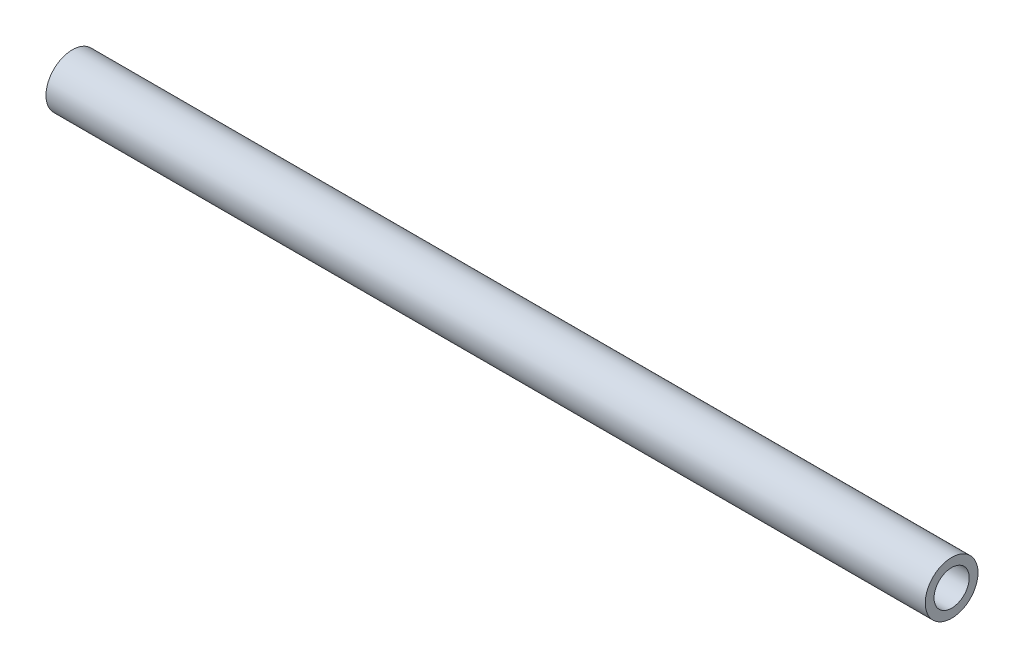
ISO-10303-21;
HEADER;
FILE_DESCRIPTION(('STEP AP214'),'2;1');
FILE_NAME('part.step','',(''),(''),'','','');
FILE_SCHEMA(('AUTOMOTIVE_DESIGN { 1 0 10303 214 1 1 1 1 }'));
ENDSEC;
DATA;
#1=APPLICATION_CONTEXT('core data for automotive mechanical design processes');
#2=APPLICATION_PROTOCOL_DEFINITION('international standard','automotive_design',2000,#1);
#3=PRODUCT_CONTEXT('',#1,'mechanical');
#4=PRODUCT('Part','Part','',(#3));
#5=PRODUCT_RELATED_PRODUCT_CATEGORY('part','',(#4));
#6=PRODUCT_DEFINITION_FORMATION('','',#4);
#7=PRODUCT_DEFINITION_CONTEXT('part definition',#1,'design');
#8=PRODUCT_DEFINITION('design','',#6,#7);
#9=PRODUCT_DEFINITION_SHAPE('','',#8);
#10=(LENGTH_UNIT() NAMED_UNIT(*) SI_UNIT(.MILLI.,.METRE.));
#11=(NAMED_UNIT(*) PLANE_ANGLE_UNIT() SI_UNIT($,.RADIAN.));
#12=(NAMED_UNIT(*) SI_UNIT($,.STERADIAN.) SOLID_ANGLE_UNIT());
#13=UNCERTAINTY_MEASURE_WITH_UNIT(LENGTH_MEASURE(1.E-05),#10,'distance_accuracy_value','');
#14=(GEOMETRIC_REPRESENTATION_CONTEXT(3) GLOBAL_UNCERTAINTY_ASSIGNED_CONTEXT((#13)) GLOBAL_UNIT_ASSIGNED_CONTEXT((#10,
#11,#12)) REPRESENTATION_CONTEXT('',''));
#15=CARTESIAN_POINT('',(0.,0.,0.));
#16=DIRECTION('',(0.,0.,1.));
#17=DIRECTION('',(1.,0.,0.));
#18=AXIS2_PLACEMENT_3D('',#15,#16,#17);
#19=CARTESIAN_POINT('',(50.,0.,0.));
#20=DIRECTION('',(1.,0.,0.));
#21=DIRECTION('',(0.,0.,-1.));
#22=AXIS2_PLACEMENT_3D('',#19,#20,#21);
#23=PLANE('',#22);
#24=CARTESIAN_POINT('',(50.,0.,0.));
#25=DIRECTION('',(1.,0.,0.));
#26=DIRECTION('',(0.,0.,-1.));
#27=AXIS2_PLACEMENT_3D('',#24,#25,#26);
#28=CIRCLE('',#27,3.);
#29=CARTESIAN_POINT('',(50.,0.,-3.));
#30=VERTEX_POINT('',#29);
#31=EDGE_CURVE('E10',#30,#30,#28,.T.);
#32=ORIENTED_EDGE('',*,*,#31,.T.);
#33=EDGE_LOOP('',(#32));
#34=FACE_BOUND('',#33,.T.);
#35=CARTESIAN_POINT('',(50.,0.,0.));
#36=DIRECTION('',(1.,0.,0.));
#37=DIRECTION('',(0.,0.,-1.));
#38=AXIS2_PLACEMENT_3D('',#35,#36,#37);
#39=CIRCLE('',#38,2.);
#40=CARTESIAN_POINT('',(50.,0.,-2.));
#41=VERTEX_POINT('',#40);
#42=EDGE_CURVE('E42',#41,#41,#39,.T.);
#43=ORIENTED_EDGE('',*,*,#42,.F.);
#44=EDGE_LOOP('',(#43));
#45=FACE_BOUND('',#44,.T.);
#46=ADVANCED_FACE('F31',(#34,#45),#23,.T.);
#47=CARTESIAN_POINT('',(-50.,0.,0.));
#48=DIRECTION('',(1.,0.,0.));
#49=DIRECTION('',(0.,0.,-1.));
#50=AXIS2_PLACEMENT_3D('',#47,#48,#49);
#51=PLANE('',#50);
#52=CARTESIAN_POINT('',(-50.,0.,0.));
#53=DIRECTION('',(1.,0.,0.));
#54=DIRECTION('',(0.,0.,-1.));
#55=AXIS2_PLACEMENT_3D('',#52,#53,#54);
#56=CIRCLE('',#55,3.);
#57=CARTESIAN_POINT('',(-50.,0.,-3.));
#58=VERTEX_POINT('',#57);
#59=EDGE_CURVE('E35',#58,#58,#56,.T.);
#60=ORIENTED_EDGE('',*,*,#59,.F.);
#61=EDGE_LOOP('',(#60));
#62=FACE_BOUND('',#61,.T.);
#63=CARTESIAN_POINT('',(-50.,0.,0.));
#64=DIRECTION('',(1.,0.,0.));
#65=DIRECTION('',(0.,0.,-1.));
#66=AXIS2_PLACEMENT_3D('',#63,#64,#65);
#67=CIRCLE('',#66,2.);
#68=CARTESIAN_POINT('',(-50.,0.,-2.));
#69=VERTEX_POINT('',#68);
#70=EDGE_CURVE('E44',#69,#69,#67,.T.);
#71=ORIENTED_EDGE('',*,*,#70,.T.);
#72=EDGE_LOOP('',(#71));
#73=FACE_BOUND('',#72,.T.);
#74=ADVANCED_FACE('F54',(#62,#73),#51,.F.);
#75=CARTESIAN_POINT('',(50.,0.,0.));
#76=DIRECTION('',(-1.,0.,0.));
#77=DIRECTION('',(0.,0.,1.));
#78=AXIS2_PLACEMENT_3D('',#75,#76,#77);
#79=CYLINDRICAL_SURFACE('',#78,3.);
#80=ORIENTED_EDGE('',*,*,#31,.F.);
#81=EDGE_LOOP('',(#80));
#82=FACE_BOUND('',#81,.T.);
#83=ORIENTED_EDGE('',*,*,#59,.T.);
#84=EDGE_LOOP('',(#83));
#85=FACE_BOUND('',#84,.T.);
#86=ADVANCED_FACE('F33',(#82,#85),#79,.T.);
#87=CARTESIAN_POINT('',(50.,0.,0.));
#88=DIRECTION('',(-1.,0.,0.));
#89=DIRECTION('',(0.,0.,1.));
#90=AXIS2_PLACEMENT_3D('',#87,#88,#89);
#91=CYLINDRICAL_SURFACE('',#90,2.);
#92=ORIENTED_EDGE('',*,*,#42,.T.);
#93=EDGE_LOOP('',(#92));
#94=FACE_BOUND('',#93,.T.);
#95=ORIENTED_EDGE('',*,*,#70,.F.);
#96=EDGE_LOOP('',(#95));
#97=FACE_BOUND('',#96,.T.);
#98=ADVANCED_FACE('F50',(#94,#97),#91,.F.);
#99=CLOSED_SHELL('',(#46,#74,#86,#98));
#100=MANIFOLD_SOLID_BREP('B2',#99);
#101=ADVANCED_BREP_SHAPE_REPRESENTATION('',(#18,#100),#14);
#102=SHAPE_DEFINITION_REPRESENTATION(#9,#101);
ENDSEC;
END-ISO-10303-21;
